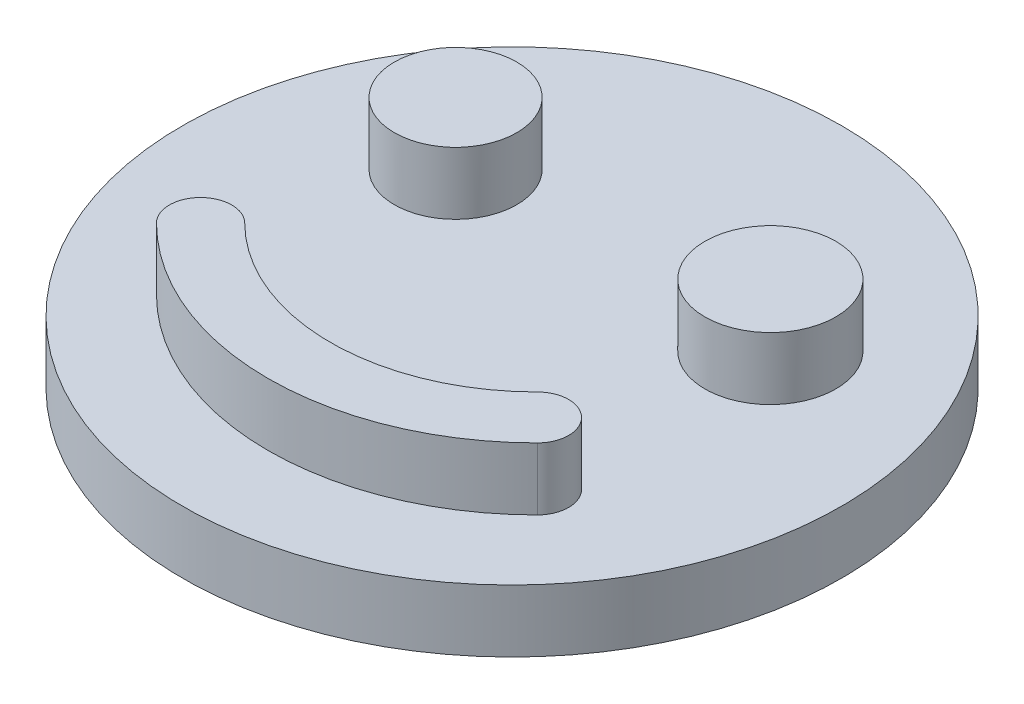
ISO-10303-21;
HEADER;
FILE_DESCRIPTION(('STEP AP214'),'2;1');
FILE_NAME('part.step','',(''),(''),'','','');
FILE_SCHEMA(('AUTOMOTIVE_DESIGN { 1 0 10303 214 1 1 1 1 }'));
ENDSEC;
DATA;
#1=APPLICATION_CONTEXT('core data for automotive mechanical design processes');
#2=APPLICATION_PROTOCOL_DEFINITION('international standard','automotive_design',2000,#1);
#3=PRODUCT_CONTEXT('',#1,'mechanical');
#4=PRODUCT('Part','Part','',(#3));
#5=PRODUCT_RELATED_PRODUCT_CATEGORY('part','',(#4));
#6=PRODUCT_DEFINITION_FORMATION('','',#4);
#7=PRODUCT_DEFINITION_CONTEXT('part definition',#1,'design');
#8=PRODUCT_DEFINITION('design','',#6,#7);
#9=PRODUCT_DEFINITION_SHAPE('','',#8);
#10=(LENGTH_UNIT() NAMED_UNIT(*) SI_UNIT(.MILLI.,.METRE.));
#11=(NAMED_UNIT(*) PLANE_ANGLE_UNIT() SI_UNIT($,.RADIAN.));
#12=(NAMED_UNIT(*) SI_UNIT($,.STERADIAN.) SOLID_ANGLE_UNIT());
#13=UNCERTAINTY_MEASURE_WITH_UNIT(LENGTH_MEASURE(1.E-05),#10,'distance_accuracy_value','');
#14=(GEOMETRIC_REPRESENTATION_CONTEXT(3) GLOBAL_UNCERTAINTY_ASSIGNED_CONTEXT((#13)) GLOBAL_UNIT_ASSIGNED_CONTEXT((#10,
#11,#12)) REPRESENTATION_CONTEXT('',''));
#15=CARTESIAN_POINT('',(0.,0.,0.));
#16=DIRECTION('',(0.,0.,1.));
#17=DIRECTION('',(1.,0.,0.));
#18=AXIS2_PLACEMENT_3D('',#15,#16,#17);
#19=CARTESIAN_POINT('',(-6.25113061584204,0.,-4.24687969146156));
#20=DIRECTION('',(0.,-1.,0.));
#21=DIRECTION('',(0.,0.,-1.));
#22=AXIS2_PLACEMENT_3D('',#19,#20,#21);
#23=PLANE('',#22);
#24=CARTESIAN_POINT('',(-6.25113061584204,0.,-4.24687969146156));
#25=DIRECTION('',(0.,-1.,0.));
#26=DIRECTION('',(0.,0.,-1.));
#27=AXIS2_PLACEMENT_3D('',#24,#25,#26);
#28=CIRCLE('',#27,52.8233122110211);
#29=CARTESIAN_POINT('',(-6.25113061584204,0.,-57.0701919024826));
#30=VERTEX_POINT('',#29);
#31=EDGE_CURVE('E98',#30,#30,#28,.T.);
#32=ORIENTED_EDGE('',*,*,#31,.F.);
#33=EDGE_LOOP('',(#32));
#34=FACE_BOUND('',#33,.T.);
#35=CARTESIAN_POINT('',(-31.1199383785866,0.,-20.059237388607));
#36=DIRECTION('',(0.,-1.,0.));
#37=DIRECTION('',(0.,0.,-1.));
#38=AXIS2_PLACEMENT_3D('',#35,#36,#37);
#39=CIRCLE('',#38,9.81309315815435);
#40=CARTESIAN_POINT('',(-31.1199383785866,0.,-29.8723305467613));
#41=VERTEX_POINT('',#40);
#42=EDGE_CURVE('E107',#41,#41,#39,.T.);
#43=ORIENTED_EDGE('',*,*,#42,.T.);
#44=EDGE_LOOP('',(#43));
#45=FACE_BOUND('',#44,.T.);
#46=CARTESIAN_POINT('',(19.3357461072453,0.,-20.059237388607));
#47=DIRECTION('',(0.,-1.,0.));
#48=DIRECTION('',(0.,0.,-1.));
#49=AXIS2_PLACEMENT_3D('',#46,#47,#48);
#50=CIRCLE('',#49,10.4982924650653);
#51=CARTESIAN_POINT('',(19.3357461072453,0.,-30.5575298536723));
#52=VERTEX_POINT('',#51);
#53=EDGE_CURVE('E11',#52,#52,#50,.F.);
#54=ORIENTED_EDGE('',*,*,#53,.F.);
#55=EDGE_LOOP('',(#54));
#56=FACE_BOUND('',#55,.T.);
#57=CARTESIAN_POINT('',(-34.1194505114624,0.,17.8096032889501));
#58=DIRECTION('',(0.,1.,0.));
#59=DIRECTION('',(0.,0.,-1.));
#60=AXIS2_PLACEMENT_3D('',#57,#58,#59);
#61=CIRCLE('',#60,5.);
#62=CARTESIAN_POINT('',(-30.5839166055297,0.,14.2740693830174));
#63=VERTEX_POINT('',#62);
#64=CARTESIAN_POINT('',(-37.6549844173952,0.,21.3451371948829));
#65=VERTEX_POINT('',#64);
#66=EDGE_CURVE('E94',#63,#65,#61,.T.);
#67=ORIENTED_EDGE('',*,*,#66,.F.);
#68=CARTESIAN_POINT('',(-7.12384131558008,0.,-9.18600590693216));
#69=DIRECTION('',(0.,-1.,0.));
#70=DIRECTION('',(0.,0.,1.));
#71=AXIS2_PLACEMENT_3D('',#68,#69,#70);
#72=CIRCLE('',#71,33.1775566493406);
#73=CARTESIAN_POINT('',(16.3362339743695,0.,14.2740693830174));
#74=VERTEX_POINT('',#73);
#75=EDGE_CURVE('E91',#74,#63,#72,.T.);
#76=ORIENTED_EDGE('',*,*,#75,.F.);
#77=CARTESIAN_POINT('',(19.8717678803022,0.,17.8096032889501));
#78=DIRECTION('',(0.,1.,0.));
#79=DIRECTION('',(0.,0.,1.));
#80=AXIS2_PLACEMENT_3D('',#77,#78,#79);
#81=CIRCLE('',#80,5.);
#82=CARTESIAN_POINT('',(23.407301786235,0.,21.3451371948829));
#83=VERTEX_POINT('',#82);
#84=EDGE_CURVE('E53',#83,#74,#81,.T.);
#85=ORIENTED_EDGE('',*,*,#84,.F.);
#86=CARTESIAN_POINT('',(-7.12384131558008,0.,-9.18600590693216));
#87=DIRECTION('',(0.,1.,0.));
#88=DIRECTION('',(0.,0.,1.));
#89=AXIS2_PLACEMENT_3D('',#86,#87,#88);
#90=CIRCLE('',#89,43.1775566493406);
#91=EDGE_CURVE('E48',#65,#83,#90,.T.);
#92=ORIENTED_EDGE('',*,*,#91,.F.);
#93=EDGE_LOOP('',(#67,#76,#85,#92));
#94=FACE_BOUND('',#93,.T.);
#95=ADVANCED_FACE('F33',(#34,#45,#56,#94),#23,.F.);
#96=CARTESIAN_POINT('',(-31.1199383785866,10.,-20.059237388607));
#97=DIRECTION('',(0.,-1.,0.));
#98=DIRECTION('',(0.,0.,-1.));
#99=AXIS2_PLACEMENT_3D('',#96,#97,#98);
#100=CYLINDRICAL_SURFACE('',#99,9.81309315815435);
#101=CARTESIAN_POINT('',(-31.1199383785866,10.,-20.059237388607));
#102=DIRECTION('',(0.,1.,0.));
#103=DIRECTION('',(0.,0.,1.));
#104=AXIS2_PLACEMENT_3D('',#101,#102,#103);
#105=CIRCLE('',#104,9.81309315815435);
#106=CARTESIAN_POINT('',(-31.1199383785866,10.,-10.2461442304526));
#107=VERTEX_POINT('',#106);
#108=EDGE_CURVE('E41',#107,#107,#105,.T.);
#109=ORIENTED_EDGE('',*,*,#108,.F.);
#110=EDGE_LOOP('',(#109));
#111=FACE_BOUND('',#110,.T.);
#112=ORIENTED_EDGE('',*,*,#42,.F.);
#113=EDGE_LOOP('',(#112));
#114=FACE_BOUND('',#113,.T.);
#115=ADVANCED_FACE('F35',(#111,#114),#100,.T.);
#116=CARTESIAN_POINT('',(-31.1199383785866,10.,-20.059237388607));
#117=DIRECTION('',(0.,1.,0.));
#118=DIRECTION('',(0.,0.,1.));
#119=AXIS2_PLACEMENT_3D('',#116,#117,#118);
#120=PLANE('',#119);
#121=ORIENTED_EDGE('',*,*,#108,.T.);
#122=EDGE_LOOP('',(#121));
#123=FACE_BOUND('',#122,.T.);
#124=ADVANCED_FACE('F114',(#123),#120,.T.);
#125=CARTESIAN_POINT('',(-6.25113061584204,-10.,-4.24687969146156));
#126=DIRECTION('',(0.,1.,0.));
#127=DIRECTION('',(0.,0.,1.));
#128=AXIS2_PLACEMENT_3D('',#125,#126,#127);
#129=CYLINDRICAL_SURFACE('',#128,52.8233122110211);
#130=CARTESIAN_POINT('',(-6.25113061584204,-10.,-4.24687969146156));
#131=DIRECTION('',(0.,-1.,0.));
#132=DIRECTION('',(0.,0.,-1.));
#133=AXIS2_PLACEMENT_3D('',#130,#131,#132);
#134=CIRCLE('',#133,52.8233122110211);
#135=CARTESIAN_POINT('',(-6.25113061584204,-10.,-57.0701919024826));
#136=VERTEX_POINT('',#135);
#137=EDGE_CURVE('E104',#136,#136,#134,.T.);
#138=ORIENTED_EDGE('',*,*,#137,.F.);
#139=EDGE_LOOP('',(#138));
#140=FACE_BOUND('',#139,.T.);
#141=ORIENTED_EDGE('',*,*,#31,.T.);
#142=EDGE_LOOP('',(#141));
#143=FACE_BOUND('',#142,.T.);
#144=ADVANCED_FACE('F162',(#140,#143),#129,.T.);
#145=CARTESIAN_POINT('',(-6.25113061584204,-10.,-4.24687969146156));
#146=DIRECTION('',(0.,-1.,0.));
#147=DIRECTION('',(0.,0.,-1.));
#148=AXIS2_PLACEMENT_3D('',#145,#146,#147);
#149=PLANE('',#148);
#150=ORIENTED_EDGE('',*,*,#137,.T.);
#151=EDGE_LOOP('',(#150));
#152=FACE_BOUND('',#151,.T.);
#153=ADVANCED_FACE('F159',(#152),#149,.T.);
#154=CARTESIAN_POINT('',(19.3357461072453,10.,-20.059237388607));
#155=DIRECTION('',(0.,-1.,0.));
#156=DIRECTION('',(0.,0.,-1.));
#157=AXIS2_PLACEMENT_3D('',#154,#155,#156);
#158=CYLINDRICAL_SURFACE('',#157,10.4982924650653);
#159=CARTESIAN_POINT('',(19.3357461072453,10.,-20.059237388607));
#160=DIRECTION('',(0.,1.,0.));
#161=DIRECTION('',(0.,0.,1.));
#162=AXIS2_PLACEMENT_3D('',#159,#160,#161);
#163=CIRCLE('',#162,10.4982924650653);
#164=CARTESIAN_POINT('',(19.3357461072453,10.,-9.56094492354165));
#165=VERTEX_POINT('',#164);
#166=EDGE_CURVE('E95',#165,#165,#163,.T.);
#167=ORIENTED_EDGE('',*,*,#166,.F.);
#168=EDGE_LOOP('',(#167));
#169=FACE_BOUND('',#168,.T.);
#170=ORIENTED_EDGE('',*,*,#53,.T.);
#171=EDGE_LOOP('',(#170));
#172=FACE_BOUND('',#171,.T.);
#173=ADVANCED_FACE('F155',(#169,#172),#158,.T.);
#174=CARTESIAN_POINT('',(19.3357461072453,10.,-20.059237388607));
#175=DIRECTION('',(0.,1.,0.));
#176=DIRECTION('',(0.,0.,1.));
#177=AXIS2_PLACEMENT_3D('',#174,#175,#176);
#178=PLANE('',#177);
#179=ORIENTED_EDGE('',*,*,#166,.T.);
#180=EDGE_LOOP('',(#179));
#181=FACE_BOUND('',#180,.T.);
#182=ADVANCED_FACE('F152',(#181),#178,.T.);
#183=CARTESIAN_POINT('',(-34.1194505114624,10.,17.8096032889501));
#184=DIRECTION('',(0.,-1.,0.));
#185=DIRECTION('',(0.,0.,-1.));
#186=AXIS2_PLACEMENT_3D('',#183,#184,#185);
#187=CYLINDRICAL_SURFACE('',#186,5.);
#188=ORIENTED_EDGE('',*,*,#66,.T.);
#189=DIRECTION('',(0.,-1.,0.));
#190=VECTOR('',#189,1.);
#191=CARTESIAN_POINT('',(-37.6549844173952,10.,21.3451371948828));
#192=LINE('',#191,#190);
#193=CARTESIAN_POINT('',(-37.6549844173952,10.,21.3451371948828));
#194=VERTEX_POINT('',#193);
#195=EDGE_CURVE('E75',#194,#65,#192,.T.);
#196=ORIENTED_EDGE('',*,*,#195,.F.);
#197=CARTESIAN_POINT('',(-34.1194505114624,10.,17.8096032889501));
#198=DIRECTION('',(0.,1.,0.));
#199=DIRECTION('',(0.,0.,-1.));
#200=AXIS2_PLACEMENT_3D('',#197,#198,#199);
#201=CIRCLE('',#200,5.);
#202=CARTESIAN_POINT('',(-30.5839166055297,10.,14.2740693830174));
#203=VERTEX_POINT('',#202);
#204=EDGE_CURVE('E82',#203,#194,#201,.T.);
#205=ORIENTED_EDGE('',*,*,#204,.F.);
#206=DIRECTION('',(0.,-1.,0.));
#207=VECTOR('',#206,1.);
#208=CARTESIAN_POINT('',(-30.5839166055297,10.,14.2740693830174));
#209=LINE('',#208,#207);
#210=EDGE_CURVE('E130',#203,#63,#209,.T.);
#211=ORIENTED_EDGE('',*,*,#210,.T.);
#212=EDGE_LOOP('',(#188,#196,#205,#211));
#213=FACE_BOUND('',#212,.T.);
#214=ADVANCED_FACE('F93',(#213),#187,.T.);
#215=CARTESIAN_POINT('',(-7.12384131558008,10.,-9.18600590693216));
#216=DIRECTION('',(0.,-1.,0.));
#217=DIRECTION('',(0.,0.,-1.));
#218=AXIS2_PLACEMENT_3D('',#215,#216,#217);
#219=CYLINDRICAL_SURFACE('',#218,43.1775566493406);
#220=ORIENTED_EDGE('',*,*,#91,.T.);
#221=DIRECTION('',(0.,-1.,0.));
#222=VECTOR('',#221,1.);
#223=CARTESIAN_POINT('',(23.407301786235,10.,21.3451371948829));
#224=LINE('',#223,#222);
#225=CARTESIAN_POINT('',(23.407301786235,10.,21.3451371948829));
#226=VERTEX_POINT('',#225);
#227=EDGE_CURVE('E78',#226,#83,#224,.T.);
#228=ORIENTED_EDGE('',*,*,#227,.F.);
#229=CARTESIAN_POINT('',(-7.12384131558008,10.,-9.18600590693216));
#230=DIRECTION('',(0.,1.,0.));
#231=DIRECTION('',(0.,0.,1.));
#232=AXIS2_PLACEMENT_3D('',#229,#230,#231);
#233=CIRCLE('',#232,43.1775566493406);
#234=EDGE_CURVE('E71',#194,#226,#233,.T.);
#235=ORIENTED_EDGE('',*,*,#234,.F.);
#236=ORIENTED_EDGE('',*,*,#195,.T.);
#237=EDGE_LOOP('',(#220,#228,#235,#236));
#238=FACE_BOUND('',#237,.T.);
#239=ADVANCED_FACE('F73',(#238),#219,.T.);
#240=CARTESIAN_POINT('',(19.8717678803022,10.,17.8096032889501));
#241=DIRECTION('',(0.,-1.,0.));
#242=DIRECTION('',(0.,0.,-1.));
#243=AXIS2_PLACEMENT_3D('',#240,#241,#242);
#244=CYLINDRICAL_SURFACE('',#243,5.);
#245=ORIENTED_EDGE('',*,*,#84,.T.);
#246=DIRECTION('',(0.,-1.,0.));
#247=VECTOR('',#246,1.);
#248=CARTESIAN_POINT('',(16.3362339743695,10.,14.2740693830174));
#249=LINE('',#248,#247);
#250=CARTESIAN_POINT('',(16.3362339743695,10.,14.2740693830174));
#251=VERTEX_POINT('',#250);
#252=EDGE_CURVE('E100',#251,#74,#249,.T.);
#253=ORIENTED_EDGE('',*,*,#252,.F.);
#254=CARTESIAN_POINT('',(19.8717678803022,10.,17.8096032889501));
#255=DIRECTION('',(0.,1.,0.));
#256=DIRECTION('',(0.,0.,1.));
#257=AXIS2_PLACEMENT_3D('',#254,#255,#256);
#258=CIRCLE('',#257,5.);
#259=EDGE_CURVE('E81',#226,#251,#258,.T.);
#260=ORIENTED_EDGE('',*,*,#259,.F.);
#261=ORIENTED_EDGE('',*,*,#227,.T.);
#262=EDGE_LOOP('',(#245,#253,#260,#261));
#263=FACE_BOUND('',#262,.T.);
#264=ADVANCED_FACE('F139',(#263),#244,.T.);
#265=CARTESIAN_POINT('',(-7.12384131558008,10.,-9.18600590693216));
#266=DIRECTION('',(0.,-1.,0.));
#267=DIRECTION('',(0.,0.,-1.));
#268=AXIS2_PLACEMENT_3D('',#265,#266,#267);
#269=CYLINDRICAL_SURFACE('',#268,33.1775566493406);
#270=ORIENTED_EDGE('',*,*,#75,.T.);
#271=ORIENTED_EDGE('',*,*,#210,.F.);
#272=CARTESIAN_POINT('',(-7.12384131558008,10.,-9.18600590693216));
#273=DIRECTION('',(0.,-1.,0.));
#274=DIRECTION('',(0.,0.,1.));
#275=AXIS2_PLACEMENT_3D('',#272,#273,#274);
#276=CIRCLE('',#275,33.1775566493406);
#277=EDGE_CURVE('E87',#251,#203,#276,.T.);
#278=ORIENTED_EDGE('',*,*,#277,.F.);
#279=ORIENTED_EDGE('',*,*,#252,.T.);
#280=EDGE_LOOP('',(#270,#271,#278,#279));
#281=FACE_BOUND('',#280,.T.);
#282=ADVANCED_FACE('F129',(#281),#269,.F.);
#283=CARTESIAN_POINT('',(-20.6216459135212,10.,4.31179869100899));
#284=DIRECTION('',(0.,-1.,0.));
#285=DIRECTION('',(0.,0.,-1.));
#286=AXIS2_PLACEMENT_3D('',#283,#284,#285);
#287=PLANE('',#286);
#288=ORIENTED_EDGE('',*,*,#204,.T.);
#289=ORIENTED_EDGE('',*,*,#234,.T.);
#290=ORIENTED_EDGE('',*,*,#259,.T.);
#291=ORIENTED_EDGE('',*,*,#277,.T.);
#292=EDGE_LOOP('',(#288,#289,#290,#291));
#293=FACE_BOUND('',#292,.T.);
#294=ADVANCED_FACE('F85',(#293),#287,.F.);
#295=CLOSED_SHELL('',(#95,#115,#124,#144,#153,#173,#182,#214,#239,#264,#282,#294));
#296=MANIFOLD_SOLID_BREP('B2',#295);
#297=ADVANCED_BREP_SHAPE_REPRESENTATION('',(#18,#296),#14);
#298=SHAPE_DEFINITION_REPRESENTATION(#9,#297);
ENDSEC;
END-ISO-10303-21;
